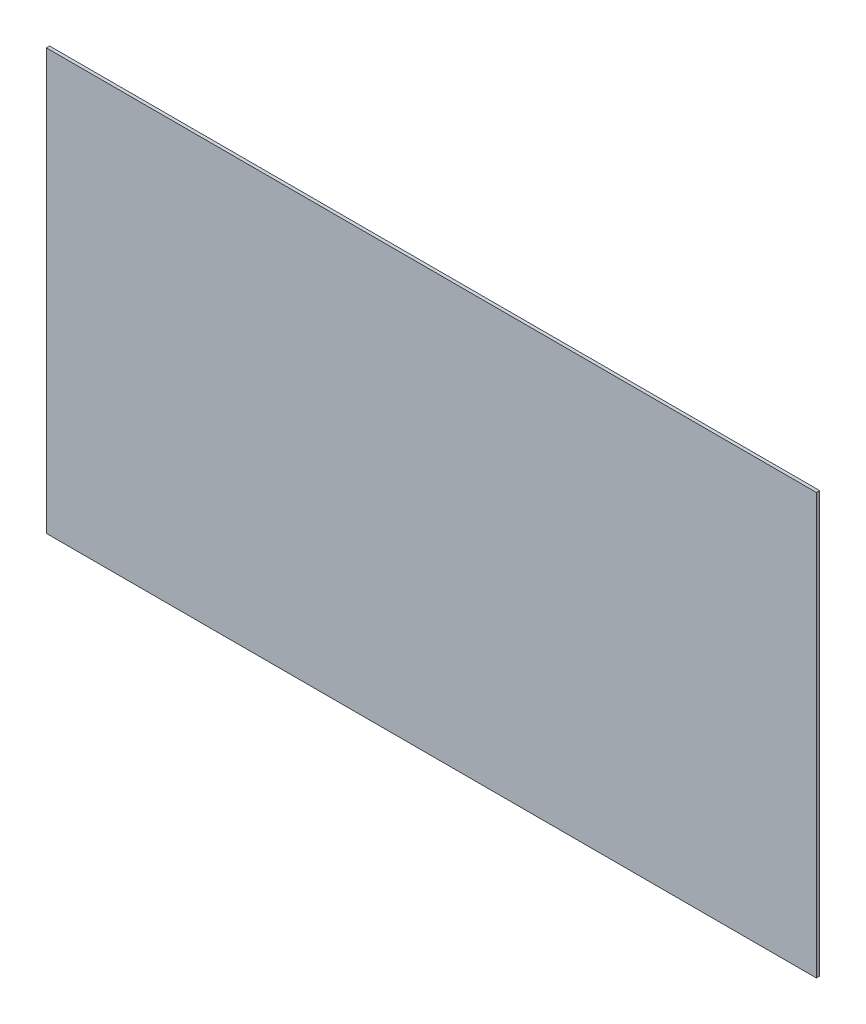
ISO-10303-21;
HEADER;
FILE_DESCRIPTION(('STEP AP214'),'2;1');
FILE_NAME('part.step','',(''),(''),'','','');
FILE_SCHEMA(('AUTOMOTIVE_DESIGN { 1 0 10303 214 1 1 1 1 }'));
ENDSEC;
DATA;
#1=APPLICATION_CONTEXT('core data for automotive mechanical design processes');
#2=APPLICATION_PROTOCOL_DEFINITION('international standard','automotive_design',2000,#1);
#3=PRODUCT_CONTEXT('',#1,'mechanical');
#4=PRODUCT('Part','Part','',(#3));
#5=PRODUCT_RELATED_PRODUCT_CATEGORY('part','',(#4));
#6=PRODUCT_DEFINITION_FORMATION('','',#4);
#7=PRODUCT_DEFINITION_CONTEXT('part definition',#1,'design');
#8=PRODUCT_DEFINITION('design','',#6,#7);
#9=PRODUCT_DEFINITION_SHAPE('','',#8);
#10=(LENGTH_UNIT() NAMED_UNIT(*) SI_UNIT(.MILLI.,.METRE.));
#11=(NAMED_UNIT(*) PLANE_ANGLE_UNIT() SI_UNIT($,.RADIAN.));
#12=(NAMED_UNIT(*) SI_UNIT($,.STERADIAN.) SOLID_ANGLE_UNIT());
#13=UNCERTAINTY_MEASURE_WITH_UNIT(LENGTH_MEASURE(1.E-05),#10,'distance_accuracy_value','');
#14=(GEOMETRIC_REPRESENTATION_CONTEXT(3) GLOBAL_UNCERTAINTY_ASSIGNED_CONTEXT((#13)) GLOBAL_UNIT_ASSIGNED_CONTEXT((#10,
#11,#12)) REPRESENTATION_CONTEXT('',''));
#15=CARTESIAN_POINT('',(0.,0.,0.));
#16=DIRECTION('',(0.,0.,1.));
#17=DIRECTION('',(1.,0.,0.));
#18=AXIS2_PLACEMENT_3D('',#15,#16,#17);
#19=CARTESIAN_POINT('',(-27.0509999999999,6.35000000000005,3.175));
#20=DIRECTION('',(-1.,0.,0.));
#21=DIRECTION('',(0.,0.,1.));
#22=AXIS2_PLACEMENT_3D('',#19,#20,#21);
#23=PLANE('',#22);
#24=DIRECTION('',(0.,1.,0.));
#25=VECTOR('',#24,1.);
#26=CARTESIAN_POINT('',(-27.0509999999999,6.35000000000005,0.));
#27=LINE('',#26,#25);
#28=CARTESIAN_POINT('',(-27.0509999999999,6.35000000000005,0.));
#29=VERTEX_POINT('',#28);
#30=CARTESIAN_POINT('',(-27.0509999999999,420.687499999996,0.));
#31=VERTEX_POINT('',#30);
#32=EDGE_CURVE('E96',#29,#31,#27,.T.);
#33=ORIENTED_EDGE('',*,*,#32,.T.);
#34=DIRECTION('',(0.,0.,-1.));
#35=VECTOR('',#34,1.);
#36=CARTESIAN_POINT('',(-27.0509999999999,420.687499999996,3.175));
#37=LINE('',#36,#35);
#38=CARTESIAN_POINT('',(-27.0509999999999,420.687499999996,3.175));
#39=VERTEX_POINT('',#38);
#40=EDGE_CURVE('E11',#39,#31,#37,.T.);
#41=ORIENTED_EDGE('',*,*,#40,.F.);
#42=DIRECTION('',(0.,1.,0.));
#43=VECTOR('',#42,1.);
#44=CARTESIAN_POINT('',(-27.0509999999999,6.35000000000005,3.175));
#45=LINE('',#44,#43);
#46=CARTESIAN_POINT('',(-27.0509999999999,6.35000000000005,3.175));
#47=VERTEX_POINT('',#46);
#48=EDGE_CURVE('E82',#47,#39,#45,.T.);
#49=ORIENTED_EDGE('',*,*,#48,.F.);
#50=DIRECTION('',(0.,0.,-1.));
#51=VECTOR('',#50,1.);
#52=CARTESIAN_POINT('',(-27.0509999999999,6.35000000000005,3.175));
#53=LINE('',#52,#51);
#54=EDGE_CURVE('E49',#47,#29,#53,.T.);
#55=ORIENTED_EDGE('',*,*,#54,.T.);
#56=EDGE_LOOP('',(#33,#41,#49,#55));
#57=FACE_BOUND('',#56,.T.);
#58=ADVANCED_FACE('F33',(#57),#23,.F.);
#59=CARTESIAN_POINT('',(-27.0509999999999,420.687499999996,3.175));
#60=DIRECTION('',(0.,-1.,0.));
#61=DIRECTION('',(0.,0.,-1.));
#62=AXIS2_PLACEMENT_3D('',#59,#60,#61);
#63=PLANE('',#62);
#64=DIRECTION('',(-1.,0.,0.));
#65=VECTOR('',#64,1.);
#66=CARTESIAN_POINT('',(-27.0509999999999,420.687499999996,0.));
#67=LINE('',#66,#65);
#68=CARTESIAN_POINT('',(-785.749,420.687499999996,0.));
#69=VERTEX_POINT('',#68);
#70=EDGE_CURVE('E87',#31,#69,#67,.T.);
#71=ORIENTED_EDGE('',*,*,#70,.T.);
#72=DIRECTION('',(0.,0.,-1.));
#73=VECTOR('',#72,1.);
#74=CARTESIAN_POINT('',(-785.749,420.687499999996,3.175));
#75=LINE('',#74,#73);
#76=CARTESIAN_POINT('',(-785.749,420.687499999996,3.175));
#77=VERTEX_POINT('',#76);
#78=EDGE_CURVE('E41',#77,#69,#75,.T.);
#79=ORIENTED_EDGE('',*,*,#78,.F.);
#80=DIRECTION('',(-1.,0.,0.));
#81=VECTOR('',#80,1.);
#82=CARTESIAN_POINT('',(-27.0509999999999,420.687499999996,3.175));
#83=LINE('',#82,#81);
#84=EDGE_CURVE('E74',#39,#77,#83,.T.);
#85=ORIENTED_EDGE('',*,*,#84,.F.);
#86=ORIENTED_EDGE('',*,*,#40,.T.);
#87=EDGE_LOOP('',(#71,#79,#85,#86));
#88=FACE_BOUND('',#87,.T.);
#89=ADVANCED_FACE('F86',(#88),#63,.F.);
#90=CARTESIAN_POINT('',(-785.749,6.35000000000005,3.175));
#91=DIRECTION('',(-1.,0.,0.));
#92=DIRECTION('',(0.,0.,1.));
#93=AXIS2_PLACEMENT_3D('',#90,#91,#92);
#94=PLANE('',#93);
#95=DIRECTION('',(0.,1.,0.));
#96=VECTOR('',#95,1.);
#97=CARTESIAN_POINT('',(-785.749,6.35000000000005,0.));
#98=LINE('',#97,#96);
#99=CARTESIAN_POINT('',(-785.749,6.35000000000005,0.));
#100=VERTEX_POINT('',#99);
#101=EDGE_CURVE('E99',#100,#69,#98,.T.);
#102=ORIENTED_EDGE('',*,*,#101,.F.);
#103=DIRECTION('',(0.,0.,-1.));
#104=VECTOR('',#103,1.);
#105=CARTESIAN_POINT('',(-785.749,6.35000000000005,3.175));
#106=LINE('',#105,#104);
#107=CARTESIAN_POINT('',(-785.749,6.35000000000005,3.175));
#108=VERTEX_POINT('',#107);
#109=EDGE_CURVE('E63',#108,#100,#106,.T.);
#110=ORIENTED_EDGE('',*,*,#109,.F.);
#111=DIRECTION('',(0.,1.,0.));
#112=VECTOR('',#111,1.);
#113=CARTESIAN_POINT('',(-785.749,6.35000000000005,3.175));
#114=LINE('',#113,#112);
#115=EDGE_CURVE('E81',#108,#77,#114,.T.);
#116=ORIENTED_EDGE('',*,*,#115,.T.);
#117=ORIENTED_EDGE('',*,*,#78,.T.);
#118=EDGE_LOOP('',(#102,#110,#116,#117));
#119=FACE_BOUND('',#118,.T.);
#120=ADVANCED_FACE('F90',(#119),#94,.T.);
#121=CARTESIAN_POINT('',(-27.0509999999999,6.35000000000005,3.175));
#122=DIRECTION('',(0.,-1.,0.));
#123=DIRECTION('',(0.,0.,-1.));
#124=AXIS2_PLACEMENT_3D('',#121,#122,#123);
#125=PLANE('',#124);
#126=DIRECTION('',(-1.,0.,0.));
#127=VECTOR('',#126,1.);
#128=CARTESIAN_POINT('',(-27.0509999999999,6.35000000000005,0.));
#129=LINE('',#128,#127);
#130=EDGE_CURVE('E101',#29,#100,#129,.T.);
#131=ORIENTED_EDGE('',*,*,#130,.F.);
#132=ORIENTED_EDGE('',*,*,#54,.F.);
#133=DIRECTION('',(-1.,0.,0.));
#134=VECTOR('',#133,1.);
#135=CARTESIAN_POINT('',(-27.0509999999999,6.35000000000005,3.175));
#136=LINE('',#135,#134);
#137=EDGE_CURVE('E91',#47,#108,#136,.T.);
#138=ORIENTED_EDGE('',*,*,#137,.T.);
#139=ORIENTED_EDGE('',*,*,#109,.T.);
#140=EDGE_LOOP('',(#131,#132,#138,#139));
#141=FACE_BOUND('',#140,.T.);
#142=ADVANCED_FACE('F107',(#141),#125,.T.);
#143=CARTESIAN_POINT('',(0.,0.,3.175));
#144=DIRECTION('',(0.,0.,1.));
#145=DIRECTION('',(1.,0.,0.));
#146=AXIS2_PLACEMENT_3D('',#143,#144,#145);
#147=PLANE('',#146);
#148=ORIENTED_EDGE('',*,*,#48,.T.);
#149=ORIENTED_EDGE('',*,*,#84,.T.);
#150=ORIENTED_EDGE('',*,*,#115,.F.);
#151=ORIENTED_EDGE('',*,*,#137,.F.);
#152=EDGE_LOOP('',(#148,#149,#150,#151));
#153=FACE_BOUND('',#152,.T.);
#154=ADVANCED_FACE('F78',(#153),#147,.T.);
#155=CARTESIAN_POINT('',(0.,0.,0.));
#156=DIRECTION('',(0.,0.,1.));
#157=DIRECTION('',(1.,0.,0.));
#158=AXIS2_PLACEMENT_3D('',#155,#156,#157);
#159=PLANE('',#158);
#160=ORIENTED_EDGE('',*,*,#32,.F.);
#161=ORIENTED_EDGE('',*,*,#130,.T.);
#162=ORIENTED_EDGE('',*,*,#101,.T.);
#163=ORIENTED_EDGE('',*,*,#70,.F.);
#164=EDGE_LOOP('',(#160,#161,#162,#163));
#165=FACE_BOUND('',#164,.T.);
#166=ADVANCED_FACE('F106',(#165),#159,.F.);
#167=CLOSED_SHELL('',(#58,#89,#120,#142,#154,#166));
#168=MANIFOLD_SOLID_BREP('B2',#167);
#169=ADVANCED_BREP_SHAPE_REPRESENTATION('',(#18,#168),#14);
#170=SHAPE_DEFINITION_REPRESENTATION(#9,#169);
ENDSEC;
END-ISO-10303-21;
